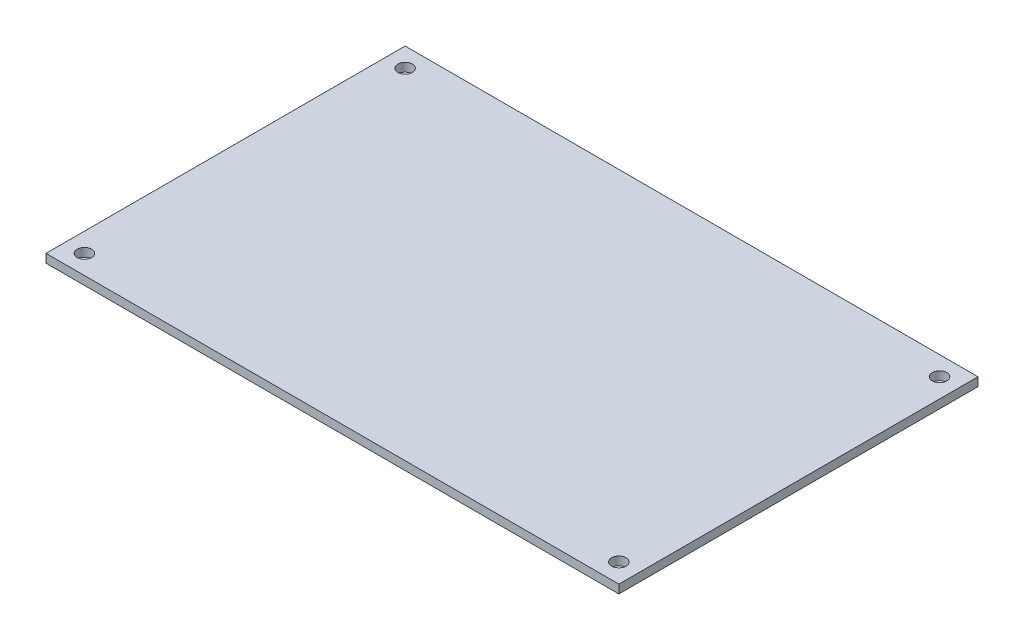
ISO-10303-21;
HEADER;
FILE_DESCRIPTION(('STEP AP214'),'2;1');
FILE_NAME('part.step','',(''),(''),'','','');
FILE_SCHEMA(('AUTOMOTIVE_DESIGN { 1 0 10303 214 1 1 1 1 }'));
ENDSEC;
DATA;
#1=APPLICATION_CONTEXT('core data for automotive mechanical design processes');
#2=APPLICATION_PROTOCOL_DEFINITION('international standard','automotive_design',2000,#1);
#3=PRODUCT_CONTEXT('',#1,'mechanical');
#4=PRODUCT('Part','Part','',(#3));
#5=PRODUCT_RELATED_PRODUCT_CATEGORY('part','',(#4));
#6=PRODUCT_DEFINITION_FORMATION('','',#4);
#7=PRODUCT_DEFINITION_CONTEXT('part definition',#1,'design');
#8=PRODUCT_DEFINITION('design','',#6,#7);
#9=PRODUCT_DEFINITION_SHAPE('','',#8);
#10=(LENGTH_UNIT() NAMED_UNIT(*) SI_UNIT(.MILLI.,.METRE.));
#11=(NAMED_UNIT(*) PLANE_ANGLE_UNIT() SI_UNIT($,.RADIAN.));
#12=(NAMED_UNIT(*) SI_UNIT($,.STERADIAN.) SOLID_ANGLE_UNIT());
#13=UNCERTAINTY_MEASURE_WITH_UNIT(LENGTH_MEASURE(1.E-05),#10,'distance_accuracy_value','');
#14=(GEOMETRIC_REPRESENTATION_CONTEXT(3) GLOBAL_UNCERTAINTY_ASSIGNED_CONTEXT((#13)) GLOBAL_UNIT_ASSIGNED_CONTEXT((#10,
#11,#12)) REPRESENTATION_CONTEXT('',''));
#15=CARTESIAN_POINT('',(0.,0.,0.));
#16=DIRECTION('',(0.,0.,1.));
#17=DIRECTION('',(1.,0.,0.));
#18=AXIS2_PLACEMENT_3D('',#15,#16,#17);
#19=CARTESIAN_POINT('',(0.,2.,0.));
#20=DIRECTION('',(1.,0.,0.));
#21=DIRECTION('',(0.,0.,-1.));
#22=AXIS2_PLACEMENT_3D('',#19,#20,#21);
#23=PLANE('',#22);
#24=DIRECTION('',(0.,0.,1.));
#25=VECTOR('',#24,1.);
#26=CARTESIAN_POINT('',(0.,0.,0.));
#27=LINE('',#26,#25);
#28=CARTESIAN_POINT('',(0.,0.,-84.));
#29=VERTEX_POINT('',#28);
#30=CARTESIAN_POINT('',(0.,0.,0.));
#31=VERTEX_POINT('',#30);
#32=EDGE_CURVE('E123',#29,#31,#27,.T.);
#33=ORIENTED_EDGE('',*,*,#32,.T.);
#34=DIRECTION('',(0.,-1.,0.));
#35=VECTOR('',#34,1.);
#36=CARTESIAN_POINT('',(0.,2.,0.));
#37=LINE('',#36,#35);
#38=CARTESIAN_POINT('',(0.,2.,0.));
#39=VERTEX_POINT('',#38);
#40=EDGE_CURVE('E12',#39,#31,#37,.T.);
#41=ORIENTED_EDGE('',*,*,#40,.F.);
#42=DIRECTION('',(0.,0.,1.));
#43=VECTOR('',#42,1.);
#44=CARTESIAN_POINT('',(0.,2.,0.));
#45=LINE('',#44,#43);
#46=CARTESIAN_POINT('',(0.,2.,-84.));
#47=VERTEX_POINT('',#46);
#48=EDGE_CURVE('E95',#47,#39,#45,.T.);
#49=ORIENTED_EDGE('',*,*,#48,.F.);
#50=DIRECTION('',(0.,-1.,0.));
#51=VECTOR('',#50,1.);
#52=CARTESIAN_POINT('',(0.,2.,-84.));
#53=LINE('',#52,#51);
#54=EDGE_CURVE('E107',#47,#29,#53,.T.);
#55=ORIENTED_EDGE('',*,*,#54,.T.);
#56=EDGE_LOOP('',(#33,#41,#49,#55));
#57=FACE_BOUND('',#56,.T.);
#58=ADVANCED_FACE('F42',(#57),#23,.F.);
#59=CARTESIAN_POINT('',(0.,2.,0.));
#60=DIRECTION('',(0.,0.,-1.));
#61=DIRECTION('',(-1.,0.,0.));
#62=AXIS2_PLACEMENT_3D('',#59,#60,#61);
#63=PLANE('',#62);
#64=DIRECTION('',(1.,0.,0.));
#65=VECTOR('',#64,1.);
#66=CARTESIAN_POINT('',(0.,0.,0.));
#67=LINE('',#66,#65);
#68=CARTESIAN_POINT('',(134.,0.,0.));
#69=VERTEX_POINT('',#68);
#70=EDGE_CURVE('E100',#31,#69,#67,.T.);
#71=ORIENTED_EDGE('',*,*,#70,.T.);
#72=DIRECTION('',(0.,-1.,0.));
#73=VECTOR('',#72,1.);
#74=CARTESIAN_POINT('',(134.,2.,0.));
#75=LINE('',#74,#73);
#76=CARTESIAN_POINT('',(134.,2.,0.));
#77=VERTEX_POINT('',#76);
#78=EDGE_CURVE('E51',#77,#69,#75,.T.);
#79=ORIENTED_EDGE('',*,*,#78,.F.);
#80=DIRECTION('',(1.,0.,0.));
#81=VECTOR('',#80,1.);
#82=CARTESIAN_POINT('',(0.,2.,0.));
#83=LINE('',#82,#81);
#84=EDGE_CURVE('E90',#39,#77,#83,.T.);
#85=ORIENTED_EDGE('',*,*,#84,.F.);
#86=ORIENTED_EDGE('',*,*,#40,.T.);
#87=EDGE_LOOP('',(#71,#79,#85,#86));
#88=FACE_BOUND('',#87,.T.);
#89=ADVANCED_FACE('F99',(#88),#63,.F.);
#90=CARTESIAN_POINT('',(134.,2.,0.));
#91=DIRECTION('',(-1.,0.,0.));
#92=DIRECTION('',(0.,0.,1.));
#93=AXIS2_PLACEMENT_3D('',#90,#91,#92);
#94=PLANE('',#93);
#95=DIRECTION('',(0.,0.,-1.));
#96=VECTOR('',#95,1.);
#97=CARTESIAN_POINT('',(134.,0.,0.));
#98=LINE('',#97,#96);
#99=CARTESIAN_POINT('',(134.,0.,-84.));
#100=VERTEX_POINT('',#99);
#101=EDGE_CURVE('E77',#69,#100,#98,.T.);
#102=ORIENTED_EDGE('',*,*,#101,.T.);
#103=DIRECTION('',(0.,-1.,0.));
#104=VECTOR('',#103,1.);
#105=CARTESIAN_POINT('',(134.,2.,-84.));
#106=LINE('',#105,#104);
#107=CARTESIAN_POINT('',(134.,2.,-84.));
#108=VERTEX_POINT('',#107);
#109=EDGE_CURVE('E101',#108,#100,#106,.T.);
#110=ORIENTED_EDGE('',*,*,#109,.F.);
#111=DIRECTION('',(0.,0.,-1.));
#112=VECTOR('',#111,1.);
#113=CARTESIAN_POINT('',(134.,2.,0.));
#114=LINE('',#113,#112);
#115=EDGE_CURVE('E93',#77,#108,#114,.T.);
#116=ORIENTED_EDGE('',*,*,#115,.F.);
#117=ORIENTED_EDGE('',*,*,#78,.T.);
#118=EDGE_LOOP('',(#102,#110,#116,#117));
#119=FACE_BOUND('',#118,.T.);
#120=ADVANCED_FACE('F103',(#119),#94,.F.);
#121=CARTESIAN_POINT('',(0.,2.,-84.));
#122=DIRECTION('',(0.,0.,1.));
#123=DIRECTION('',(1.,0.,0.));
#124=AXIS2_PLACEMENT_3D('',#121,#122,#123);
#125=PLANE('',#124);
#126=DIRECTION('',(-1.,0.,0.));
#127=VECTOR('',#126,1.);
#128=CARTESIAN_POINT('',(0.,0.,-84.));
#129=LINE('',#128,#127);
#130=EDGE_CURVE('E83',#100,#29,#129,.T.);
#131=ORIENTED_EDGE('',*,*,#130,.T.);
#132=ORIENTED_EDGE('',*,*,#54,.F.);
#133=DIRECTION('',(-1.,0.,0.));
#134=VECTOR('',#133,1.);
#135=CARTESIAN_POINT('',(0.,2.,-84.));
#136=LINE('',#135,#134);
#137=EDGE_CURVE('E60',#108,#47,#136,.T.);
#138=ORIENTED_EDGE('',*,*,#137,.F.);
#139=ORIENTED_EDGE('',*,*,#109,.T.);
#140=EDGE_LOOP('',(#131,#132,#138,#139));
#141=FACE_BOUND('',#140,.T.);
#142=ADVANCED_FACE('F180',(#141),#125,.F.);
#143=CARTESIAN_POINT('',(0.,2.,0.));
#144=DIRECTION('',(0.,-1.,0.));
#145=DIRECTION('',(0.,0.,-1.));
#146=AXIS2_PLACEMENT_3D('',#143,#144,#145);
#147=PLANE('',#146);
#148=CARTESIAN_POINT('',(4.50000000000002,2.,-79.5));
#149=DIRECTION('',(0.,1.,0.));
#150=DIRECTION('',(0.,0.,1.));
#151=AXIS2_PLACEMENT_3D('',#148,#149,#150);
#152=CIRCLE('',#151,1.69999999999999);
#153=CARTESIAN_POINT('',(4.50000000000002,2.,-77.8));
#154=VERTEX_POINT('',#153);
#155=EDGE_CURVE('E143',#154,#154,#152,.T.);
#156=ORIENTED_EDGE('',*,*,#155,.F.);
#157=EDGE_LOOP('',(#156));
#158=FACE_BOUND('',#157,.T.);
#159=CARTESIAN_POINT('',(129.5,2.,-79.5));
#160=DIRECTION('',(0.,1.,0.));
#161=DIRECTION('',(0.,0.,1.));
#162=AXIS2_PLACEMENT_3D('',#159,#160,#161);
#163=CIRCLE('',#162,1.69999999999998);
#164=CARTESIAN_POINT('',(129.5,2.,-77.8));
#165=VERTEX_POINT('',#164);
#166=EDGE_CURVE('E138',#165,#165,#163,.T.);
#167=ORIENTED_EDGE('',*,*,#166,.F.);
#168=EDGE_LOOP('',(#167));
#169=FACE_BOUND('',#168,.T.);
#170=CARTESIAN_POINT('',(129.5,2.,-4.50000000000005));
#171=DIRECTION('',(0.,1.,0.));
#172=DIRECTION('',(0.,0.,1.));
#173=AXIS2_PLACEMENT_3D('',#170,#171,#172);
#174=CIRCLE('',#173,1.69999999999998);
#175=CARTESIAN_POINT('',(129.5,2.,-2.80000000000007));
#176=VERTEX_POINT('',#175);
#177=EDGE_CURVE('E132',#176,#176,#174,.T.);
#178=ORIENTED_EDGE('',*,*,#177,.F.);
#179=EDGE_LOOP('',(#178));
#180=FACE_BOUND('',#179,.T.);
#181=CARTESIAN_POINT('',(4.50000000000003,2.,-4.49999999999998));
#182=DIRECTION('',(0.,1.,0.));
#183=DIRECTION('',(0.,0.,1.));
#184=AXIS2_PLACEMENT_3D('',#181,#182,#183);
#185=CIRCLE('',#184,1.69999999999999);
#186=CARTESIAN_POINT('',(4.50000000000003,2.,-2.79999999999999));
#187=VERTEX_POINT('',#186);
#188=EDGE_CURVE('E124',#187,#187,#185,.T.);
#189=ORIENTED_EDGE('',*,*,#188,.F.);
#190=EDGE_LOOP('',(#189));
#191=FACE_BOUND('',#190,.T.);
#192=ORIENTED_EDGE('',*,*,#48,.T.);
#193=ORIENTED_EDGE('',*,*,#84,.T.);
#194=ORIENTED_EDGE('',*,*,#115,.T.);
#195=ORIENTED_EDGE('',*,*,#137,.T.);
#196=EDGE_LOOP('',(#192,#193,#194,#195));
#197=FACE_BOUND('',#196,.T.);
#198=ADVANCED_FACE('F91',(#158,#169,#180,#191,#197),#147,.F.);
#199=CARTESIAN_POINT('',(0.,0.,0.));
#200=DIRECTION('',(0.,-1.,0.));
#201=DIRECTION('',(0.,0.,-1.));
#202=AXIS2_PLACEMENT_3D('',#199,#200,#201);
#203=PLANE('',#202);
#204=CARTESIAN_POINT('',(4.50000000000002,0.,-79.5));
#205=DIRECTION('',(0.,-1.,0.));
#206=DIRECTION('',(0.,0.,-1.));
#207=AXIS2_PLACEMENT_3D('',#204,#205,#206);
#208=CIRCLE('',#207,1.69999999999999);
#209=CARTESIAN_POINT('',(4.50000000000002,0.,-81.2));
#210=VERTEX_POINT('',#209);
#211=EDGE_CURVE('E45',#210,#210,#208,.T.);
#212=ORIENTED_EDGE('',*,*,#211,.F.);
#213=EDGE_LOOP('',(#212));
#214=FACE_BOUND('',#213,.T.);
#215=CARTESIAN_POINT('',(129.5,0.,-79.5));
#216=DIRECTION('',(0.,-1.,0.));
#217=DIRECTION('',(0.,0.,-1.));
#218=AXIS2_PLACEMENT_3D('',#215,#216,#217);
#219=CIRCLE('',#218,1.69999999999998);
#220=CARTESIAN_POINT('',(129.5,0.,-81.1999999999999));
#221=VERTEX_POINT('',#220);
#222=EDGE_CURVE('E137',#221,#221,#219,.T.);
#223=ORIENTED_EDGE('',*,*,#222,.F.);
#224=EDGE_LOOP('',(#223));
#225=FACE_BOUND('',#224,.T.);
#226=CARTESIAN_POINT('',(129.5,0.,-4.50000000000005));
#227=DIRECTION('',(0.,-1.,0.));
#228=DIRECTION('',(0.,0.,-1.));
#229=AXIS2_PLACEMENT_3D('',#226,#227,#228);
#230=CIRCLE('',#229,1.69999999999998);
#231=CARTESIAN_POINT('',(129.5,0.,-6.20000000000003));
#232=VERTEX_POINT('',#231);
#233=EDGE_CURVE('E129',#232,#232,#230,.T.);
#234=ORIENTED_EDGE('',*,*,#233,.F.);
#235=EDGE_LOOP('',(#234));
#236=FACE_BOUND('',#235,.T.);
#237=CARTESIAN_POINT('',(4.50000000000003,0.,-4.49999999999998));
#238=DIRECTION('',(0.,-1.,0.));
#239=DIRECTION('',(0.,0.,-1.));
#240=AXIS2_PLACEMENT_3D('',#237,#238,#239);
#241=CIRCLE('',#240,1.69999999999999);
#242=CARTESIAN_POINT('',(4.50000000000003,0.,-6.19999999999996));
#243=VERTEX_POINT('',#242);
#244=EDGE_CURVE('E121',#243,#243,#241,.T.);
#245=ORIENTED_EDGE('',*,*,#244,.F.);
#246=EDGE_LOOP('',(#245));
#247=FACE_BOUND('',#246,.T.);
#248=ORIENTED_EDGE('',*,*,#32,.F.);
#249=ORIENTED_EDGE('',*,*,#130,.F.);
#250=ORIENTED_EDGE('',*,*,#101,.F.);
#251=ORIENTED_EDGE('',*,*,#70,.F.);
#252=EDGE_LOOP('',(#248,#249,#250,#251));
#253=FACE_BOUND('',#252,.T.);
#254=ADVANCED_FACE('F168',(#214,#225,#236,#247,#253),#203,.T.);
#255=CARTESIAN_POINT('',(4.50000000000003,2.,-4.49999999999998));
#256=DIRECTION('',(0.,1.,0.));
#257=DIRECTION('',(0.,0.,1.));
#258=AXIS2_PLACEMENT_3D('',#255,#256,#257);
#259=CYLINDRICAL_SURFACE('',#258,1.69999999999999);
#260=ORIENTED_EDGE('',*,*,#244,.T.);
#261=EDGE_LOOP('',(#260));
#262=FACE_BOUND('',#261,.T.);
#263=ORIENTED_EDGE('',*,*,#188,.T.);
#264=EDGE_LOOP('',(#263));
#265=FACE_BOUND('',#264,.T.);
#266=ADVANCED_FACE('F170',(#262,#265),#259,.F.);
#267=CARTESIAN_POINT('',(129.5,2.,-4.50000000000005));
#268=DIRECTION('',(0.,1.,0.));
#269=DIRECTION('',(0.,0.,1.));
#270=AXIS2_PLACEMENT_3D('',#267,#268,#269);
#271=CYLINDRICAL_SURFACE('',#270,1.69999999999998);
#272=ORIENTED_EDGE('',*,*,#233,.T.);
#273=EDGE_LOOP('',(#272));
#274=FACE_BOUND('',#273,.T.);
#275=ORIENTED_EDGE('',*,*,#177,.T.);
#276=EDGE_LOOP('',(#275));
#277=FACE_BOUND('',#276,.T.);
#278=ADVANCED_FACE('F177',(#274,#277),#271,.F.);
#279=CARTESIAN_POINT('',(129.5,2.,-79.5));
#280=DIRECTION('',(0.,1.,0.));
#281=DIRECTION('',(0.,0.,1.));
#282=AXIS2_PLACEMENT_3D('',#279,#280,#281);
#283=CYLINDRICAL_SURFACE('',#282,1.69999999999998);
#284=ORIENTED_EDGE('',*,*,#222,.T.);
#285=EDGE_LOOP('',(#284));
#286=FACE_BOUND('',#285,.T.);
#287=ORIENTED_EDGE('',*,*,#166,.T.);
#288=EDGE_LOOP('',(#287));
#289=FACE_BOUND('',#288,.T.);
#290=ADVANCED_FACE('F221',(#286,#289),#283,.F.);
#291=CARTESIAN_POINT('',(4.50000000000002,2.,-79.5));
#292=DIRECTION('',(0.,1.,0.));
#293=DIRECTION('',(0.,0.,1.));
#294=AXIS2_PLACEMENT_3D('',#291,#292,#293);
#295=CYLINDRICAL_SURFACE('',#294,1.69999999999999);
#296=ORIENTED_EDGE('',*,*,#211,.T.);
#297=EDGE_LOOP('',(#296));
#298=FACE_BOUND('',#297,.T.);
#299=ORIENTED_EDGE('',*,*,#155,.T.);
#300=EDGE_LOOP('',(#299));
#301=FACE_BOUND('',#300,.T.);
#302=ADVANCED_FACE('F231',(#298,#301),#295,.F.);
#303=CLOSED_SHELL('',(#58,#89,#120,#142,#198,#254,#266,#278,#290,#302));
#304=MANIFOLD_SOLID_BREP('B2',#303);
#305=ADVANCED_BREP_SHAPE_REPRESENTATION('',(#18,#304),#14);
#306=SHAPE_DEFINITION_REPRESENTATION(#9,#305);
ENDSEC;
END-ISO-10303-21;
